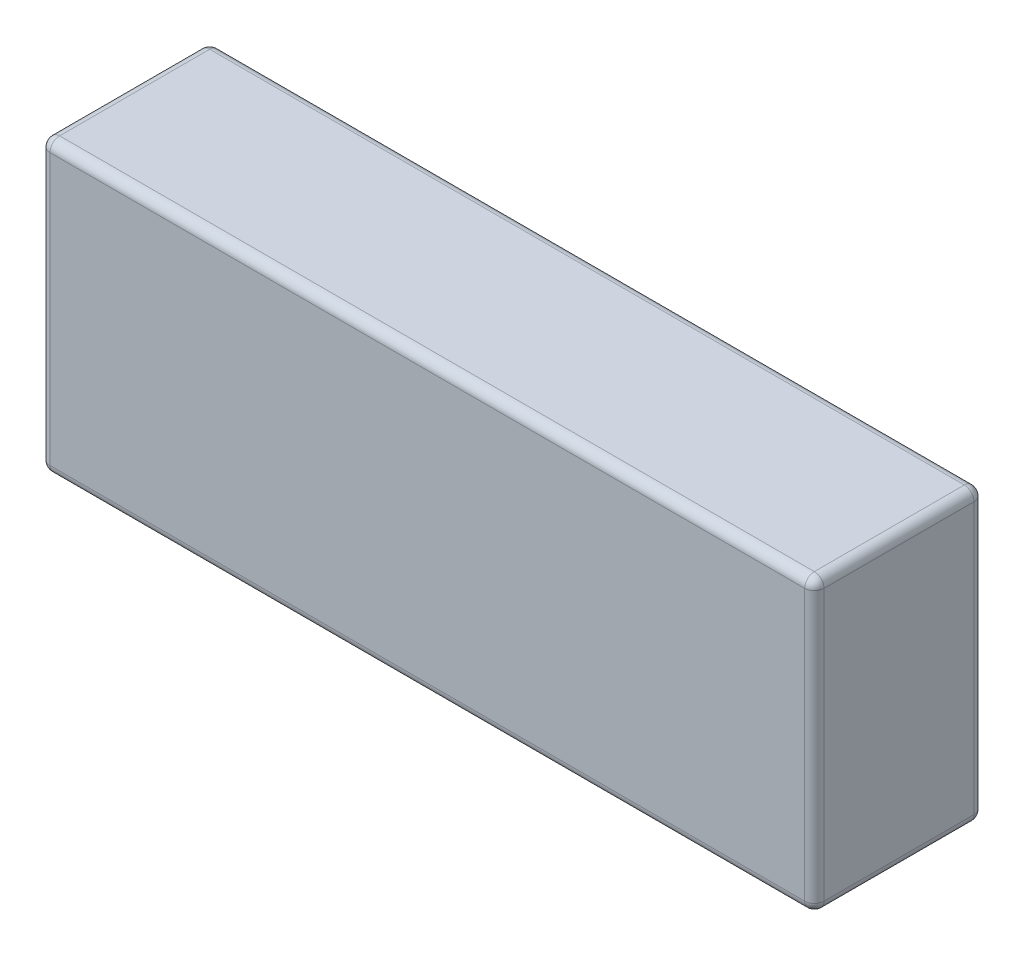
ISO-10303-21;
HEADER;
FILE_DESCRIPTION(('STEP AP214'),'2;1');
FILE_NAME('part.step','',(''),(''),'','','');
FILE_SCHEMA(('AUTOMOTIVE_DESIGN { 1 0 10303 214 1 1 1 1 }'));
ENDSEC;
DATA;
#1=APPLICATION_CONTEXT('core data for automotive mechanical design processes');
#2=APPLICATION_PROTOCOL_DEFINITION('international standard','automotive_design',2000,#1);
#3=PRODUCT_CONTEXT('',#1,'mechanical');
#4=PRODUCT('Part','Part','',(#3));
#5=PRODUCT_RELATED_PRODUCT_CATEGORY('part','',(#4));
#6=PRODUCT_DEFINITION_FORMATION('','',#4);
#7=PRODUCT_DEFINITION_CONTEXT('part definition',#1,'design');
#8=PRODUCT_DEFINITION('design','',#6,#7);
#9=PRODUCT_DEFINITION_SHAPE('','',#8);
#10=(LENGTH_UNIT() NAMED_UNIT(*) SI_UNIT(.MILLI.,.METRE.));
#11=(NAMED_UNIT(*) PLANE_ANGLE_UNIT() SI_UNIT($,.RADIAN.));
#12=(NAMED_UNIT(*) SI_UNIT($,.STERADIAN.) SOLID_ANGLE_UNIT());
#13=UNCERTAINTY_MEASURE_WITH_UNIT(LENGTH_MEASURE(1.E-05),#10,'distance_accuracy_value','');
#14=(GEOMETRIC_REPRESENTATION_CONTEXT(3) GLOBAL_UNCERTAINTY_ASSIGNED_CONTEXT((#13)) GLOBAL_UNIT_ASSIGNED_CONTEXT((#10,
#11,#12)) REPRESENTATION_CONTEXT('',''));
#15=CARTESIAN_POINT('',(0.,0.,0.));
#16=DIRECTION('',(0.,0.,1.));
#17=DIRECTION('',(1.,0.,0.));
#18=AXIS2_PLACEMENT_3D('',#15,#16,#17);
#19=CARTESIAN_POINT('',(0.,0.,35.));
#20=DIRECTION('',(1.,0.,0.));
#21=DIRECTION('',(0.,0.,-1.));
#22=AXIS2_PLACEMENT_3D('',#19,#20,#21);
#23=PLANE('',#22);
#24=DIRECTION('',(0.,-1.,0.));
#25=VECTOR('',#24,1.);
#26=CARTESIAN_POINT('',(0.,0.,2.));
#27=LINE('',#26,#25);
#28=CARTESIAN_POINT('',(0.,58.,2.));
#29=VERTEX_POINT('',#28);
#30=CARTESIAN_POINT('',(0.,2.,2.));
#31=VERTEX_POINT('',#30);
#32=EDGE_CURVE('E184',#29,#31,#27,.T.);
#33=ORIENTED_EDGE('',*,*,#32,.T.);
#34=DIRECTION('',(0.,0.,-1.));
#35=VECTOR('',#34,1.);
#36=CARTESIAN_POINT('',(0.,2.,35.));
#37=LINE('',#36,#35);
#38=CARTESIAN_POINT('',(0.,2.,33.));
#39=VERTEX_POINT('',#38);
#40=EDGE_CURVE('E187',#31,#39,#37,.F.);
#41=ORIENTED_EDGE('',*,*,#40,.T.);
#42=DIRECTION('',(0.,-1.,0.));
#43=VECTOR('',#42,1.);
#44=CARTESIAN_POINT('',(0.,0.,33.));
#45=LINE('',#44,#43);
#46=CARTESIAN_POINT('',(0.,58.,33.));
#47=VERTEX_POINT('',#46);
#48=EDGE_CURVE('E178',#39,#47,#45,.F.);
#49=ORIENTED_EDGE('',*,*,#48,.T.);
#50=DIRECTION('',(0.,0.,-1.));
#51=VECTOR('',#50,1.);
#52=CARTESIAN_POINT('',(0.,58.,35.));
#53=LINE('',#52,#51);
#54=EDGE_CURVE('E181',#47,#29,#53,.T.);
#55=ORIENTED_EDGE('',*,*,#54,.T.);
#56=EDGE_LOOP('',(#33,#41,#49,#55));
#57=FACE_BOUND('',#56,.T.);
#58=ADVANCED_FACE('F39',(#57),#23,.F.);
#59=CARTESIAN_POINT('',(0.,0.,35.));
#60=DIRECTION('',(0.,1.,0.));
#61=DIRECTION('',(0.,0.,1.));
#62=AXIS2_PLACEMENT_3D('',#59,#60,#61);
#63=PLANE('',#62);
#64=DIRECTION('',(1.,0.,0.));
#65=VECTOR('',#64,1.);
#66=CARTESIAN_POINT('',(0.,0.,33.));
#67=LINE('',#66,#65);
#68=CARTESIAN_POINT('',(158.,0.,33.));
#69=VERTEX_POINT('',#68);
#70=CARTESIAN_POINT('',(2.,0.,33.));
#71=VERTEX_POINT('',#70);
#72=EDGE_CURVE('E132',#69,#71,#67,.F.);
#73=ORIENTED_EDGE('',*,*,#72,.T.);
#74=DIRECTION('',(0.,0.,-1.));
#75=VECTOR('',#74,1.);
#76=CARTESIAN_POINT('',(2.,0.,35.));
#77=LINE('',#76,#75);
#78=CARTESIAN_POINT('',(2.,0.,2.));
#79=VERTEX_POINT('',#78);
#80=EDGE_CURVE('E175',#71,#79,#77,.T.);
#81=ORIENTED_EDGE('',*,*,#80,.T.);
#82=DIRECTION('',(1.,0.,0.));
#83=VECTOR('',#82,1.);
#84=CARTESIAN_POINT('',(160.,0.,2.));
#85=LINE('',#84,#83);
#86=CARTESIAN_POINT('',(158.,0.,2.));
#87=VERTEX_POINT('',#86);
#88=EDGE_CURVE('E135',#79,#87,#85,.T.);
#89=ORIENTED_EDGE('',*,*,#88,.T.);
#90=DIRECTION('',(0.,0.,-1.));
#91=VECTOR('',#90,1.);
#92=CARTESIAN_POINT('',(158.,0.,35.));
#93=LINE('',#92,#91);
#94=EDGE_CURVE('E127',#87,#69,#93,.F.);
#95=ORIENTED_EDGE('',*,*,#94,.T.);
#96=EDGE_LOOP('',(#73,#81,#89,#95));
#97=FACE_BOUND('',#96,.T.);
#98=ADVANCED_FACE('F129',(#97),#63,.F.);
#99=CARTESIAN_POINT('',(160.,0.,35.));
#100=DIRECTION('',(-1.,0.,0.));
#101=DIRECTION('',(0.,0.,1.));
#102=AXIS2_PLACEMENT_3D('',#99,#100,#101);
#103=PLANE('',#102);
#104=DIRECTION('',(0.,1.,0.));
#105=VECTOR('',#104,1.);
#106=CARTESIAN_POINT('',(160.,0.,33.));
#107=LINE('',#106,#105);
#108=CARTESIAN_POINT('',(160.,58.,33.));
#109=VERTEX_POINT('',#108);
#110=CARTESIAN_POINT('',(160.,2.,33.));
#111=VERTEX_POINT('',#110);
#112=EDGE_CURVE('E204',#109,#111,#107,.F.);
#113=ORIENTED_EDGE('',*,*,#112,.T.);
#114=DIRECTION('',(0.,0.,-1.));
#115=VECTOR('',#114,1.);
#116=CARTESIAN_POINT('',(160.,2.,35.));
#117=LINE('',#116,#115);
#118=CARTESIAN_POINT('',(160.,2.,2.));
#119=VERTEX_POINT('',#118);
#120=EDGE_CURVE('E147',#111,#119,#117,.T.);
#121=ORIENTED_EDGE('',*,*,#120,.T.);
#122=DIRECTION('',(0.,1.,0.));
#123=VECTOR('',#122,1.);
#124=CARTESIAN_POINT('',(160.,60.,2.));
#125=LINE('',#124,#123);
#126=CARTESIAN_POINT('',(160.,58.,2.));
#127=VERTEX_POINT('',#126);
#128=EDGE_CURVE('E210',#119,#127,#125,.T.);
#129=ORIENTED_EDGE('',*,*,#128,.T.);
#130=DIRECTION('',(0.,0.,-1.));
#131=VECTOR('',#130,1.);
#132=CARTESIAN_POINT('',(160.,58.,35.));
#133=LINE('',#132,#131);
#134=EDGE_CURVE('E207',#127,#109,#133,.F.);
#135=ORIENTED_EDGE('',*,*,#134,.T.);
#136=EDGE_LOOP('',(#113,#121,#129,#135));
#137=FACE_BOUND('',#136,.T.);
#138=ADVANCED_FACE('F378',(#137),#103,.F.);
#139=CARTESIAN_POINT('',(0.,60.,35.));
#140=DIRECTION('',(0.,-1.,0.));
#141=DIRECTION('',(0.,0.,-1.));
#142=AXIS2_PLACEMENT_3D('',#139,#140,#141);
#143=PLANE('',#142);
#144=DIRECTION('',(0.,0.,-1.));
#145=VECTOR('',#144,1.);
#146=CARTESIAN_POINT('',(158.,60.,35.));
#147=LINE('',#146,#145);
#148=CARTESIAN_POINT('',(158.,60.,33.));
#149=VERTEX_POINT('',#148);
#150=CARTESIAN_POINT('',(158.,60.,2.));
#151=VERTEX_POINT('',#150);
#152=EDGE_CURVE('E221',#149,#151,#147,.T.);
#153=ORIENTED_EDGE('',*,*,#152,.T.);
#154=DIRECTION('',(-1.,0.,0.));
#155=VECTOR('',#154,1.);
#156=CARTESIAN_POINT('',(0.,60.,2.));
#157=LINE('',#156,#155);
#158=CARTESIAN_POINT('',(2.,60.,2.));
#159=VERTEX_POINT('',#158);
#160=EDGE_CURVE('E225',#151,#159,#157,.T.);
#161=ORIENTED_EDGE('',*,*,#160,.T.);
#162=DIRECTION('',(0.,0.,-1.));
#163=VECTOR('',#162,1.);
#164=CARTESIAN_POINT('',(2.,60.,35.));
#165=LINE('',#164,#163);
#166=CARTESIAN_POINT('',(2.,60.,33.));
#167=VERTEX_POINT('',#166);
#168=EDGE_CURVE('E218',#159,#167,#165,.F.);
#169=ORIENTED_EDGE('',*,*,#168,.T.);
#170=DIRECTION('',(-1.,0.,0.));
#171=VECTOR('',#170,1.);
#172=CARTESIAN_POINT('',(0.,60.,33.));
#173=LINE('',#172,#171);
#174=EDGE_CURVE('E215',#167,#149,#173,.F.);
#175=ORIENTED_EDGE('',*,*,#174,.T.);
#176=EDGE_LOOP('',(#153,#161,#169,#175));
#177=FACE_BOUND('',#176,.T.);
#178=ADVANCED_FACE('F327',(#177),#143,.F.);
#179=CARTESIAN_POINT('',(0.,0.,35.));
#180=DIRECTION('',(0.,0.,-1.));
#181=DIRECTION('',(-1.,0.,0.));
#182=AXIS2_PLACEMENT_3D('',#179,#180,#181);
#183=PLANE('',#182);
#184=DIRECTION('',(0.,1.,0.));
#185=VECTOR('',#184,1.);
#186=CARTESIAN_POINT('',(158.,0.,35.));
#187=LINE('',#186,#185);
#188=CARTESIAN_POINT('',(158.,2.,35.));
#189=VERTEX_POINT('',#188);
#190=CARTESIAN_POINT('',(158.,58.,35.));
#191=VERTEX_POINT('',#190);
#192=EDGE_CURVE('E49',#189,#191,#187,.T.);
#193=ORIENTED_EDGE('',*,*,#192,.T.);
#194=DIRECTION('',(-1.,0.,0.));
#195=VECTOR('',#194,1.);
#196=CARTESIAN_POINT('',(0.,58.,35.));
#197=LINE('',#196,#195);
#198=CARTESIAN_POINT('',(2.,58.,35.));
#199=VERTEX_POINT('',#198);
#200=EDGE_CURVE('E11',#191,#199,#197,.T.);
#201=ORIENTED_EDGE('',*,*,#200,.T.);
#202=DIRECTION('',(0.,-1.,0.));
#203=VECTOR('',#202,1.);
#204=CARTESIAN_POINT('',(2.,0.,35.));
#205=LINE('',#204,#203);
#206=CARTESIAN_POINT('',(2.,2.,35.));
#207=VERTEX_POINT('',#206);
#208=EDGE_CURVE('E228',#199,#207,#205,.T.);
#209=ORIENTED_EDGE('',*,*,#208,.T.);
#210=DIRECTION('',(1.,0.,0.));
#211=VECTOR('',#210,1.);
#212=CARTESIAN_POINT('',(0.,2.,35.));
#213=LINE('',#212,#211);
#214=EDGE_CURVE('E60',#207,#189,#213,.T.);
#215=ORIENTED_EDGE('',*,*,#214,.T.);
#216=EDGE_LOOP('',(#193,#201,#209,#215));
#217=FACE_BOUND('',#216,.T.);
#218=ADVANCED_FACE('F342',(#217),#183,.F.);
#219=CARTESIAN_POINT('',(0.,0.,0.));
#220=DIRECTION('',(0.,0.,-1.));
#221=DIRECTION('',(-1.,0.,0.));
#222=AXIS2_PLACEMENT_3D('',#219,#220,#221);
#223=PLANE('',#222);
#224=DIRECTION('',(0.,1.,0.));
#225=VECTOR('',#224,1.);
#226=CARTESIAN_POINT('',(158.,0.,0.));
#227=LINE('',#226,#225);
#228=CARTESIAN_POINT('',(158.,58.,0.));
#229=VERTEX_POINT('',#228);
#230=CARTESIAN_POINT('',(158.,2.,0.));
#231=VERTEX_POINT('',#230);
#232=EDGE_CURVE('E194',#229,#231,#227,.F.);
#233=ORIENTED_EDGE('',*,*,#232,.T.);
#234=DIRECTION('',(1.,0.,0.));
#235=VECTOR('',#234,1.);
#236=CARTESIAN_POINT('',(0.,2.,0.));
#237=LINE('',#236,#235);
#238=CARTESIAN_POINT('',(2.,2.,0.));
#239=VERTEX_POINT('',#238);
#240=EDGE_CURVE('E200',#231,#239,#237,.F.);
#241=ORIENTED_EDGE('',*,*,#240,.T.);
#242=DIRECTION('',(0.,-1.,0.));
#243=VECTOR('',#242,1.);
#244=CARTESIAN_POINT('',(2.,60.,0.));
#245=LINE('',#244,#243);
#246=CARTESIAN_POINT('',(2.,58.,0.));
#247=VERTEX_POINT('',#246);
#248=EDGE_CURVE('E197',#239,#247,#245,.F.);
#249=ORIENTED_EDGE('',*,*,#248,.T.);
#250=DIRECTION('',(-1.,0.,0.));
#251=VECTOR('',#250,1.);
#252=CARTESIAN_POINT('',(160.,58.,0.));
#253=LINE('',#252,#251);
#254=EDGE_CURVE('E191',#247,#229,#253,.F.);
#255=ORIENTED_EDGE('',*,*,#254,.T.);
#256=EDGE_LOOP('',(#233,#241,#249,#255));
#257=FACE_BOUND('',#256,.T.);
#258=ADVANCED_FACE('F318',(#257),#223,.T.);
#259=CARTESIAN_POINT('',(158.,58.,35.));
#260=DIRECTION('',(0.,0.,-1.));
#261=DIRECTION('',(-1.,0.,0.));
#262=AXIS2_PLACEMENT_3D('',#259,#260,#261);
#263=CYLINDRICAL_SURFACE('',#262,2.);
#264=CARTESIAN_POINT('',(158.,58.,33.));
#265=DIRECTION('',(0.,0.,1.));
#266=DIRECTION('',(1.,0.,0.));
#267=AXIS2_PLACEMENT_3D('',#264,#265,#266);
#268=CIRCLE('',#267,2.);
#269=EDGE_CURVE('E43',#109,#149,#268,.T.);
#270=ORIENTED_EDGE('',*,*,#269,.F.);
#271=ORIENTED_EDGE('',*,*,#134,.F.);
#272=CARTESIAN_POINT('',(158.,58.,2.));
#273=DIRECTION('',(0.,0.,-1.));
#274=DIRECTION('',(-1.,0.,0.));
#275=AXIS2_PLACEMENT_3D('',#272,#273,#274);
#276=CIRCLE('',#275,2.);
#277=EDGE_CURVE('E171',#151,#127,#276,.T.);
#278=ORIENTED_EDGE('',*,*,#277,.F.);
#279=ORIENTED_EDGE('',*,*,#152,.F.);
#280=EDGE_LOOP('',(#270,#271,#278,#279));
#281=FACE_BOUND('',#280,.T.);
#282=ADVANCED_FACE('F41',(#281),#263,.T.);
#283=CARTESIAN_POINT('',(158.,58.,33.));
#284=DIRECTION('',(0.,0.,1.));
#285=DIRECTION('',(1.,0.,0.));
#286=AXIS2_PLACEMENT_3D('',#283,#284,#285);
#287=SPHERICAL_SURFACE('',#286,2.);
#288=CARTESIAN_POINT('',(158.,58.,33.));
#289=DIRECTION('',(0.,1.,0.));
#290=DIRECTION('',(0.,0.,1.));
#291=AXIS2_PLACEMENT_3D('',#288,#289,#290);
#292=CIRCLE('',#291,2.);
#293=EDGE_CURVE('E295',#109,#191,#292,.F.);
#294=ORIENTED_EDGE('',*,*,#293,.F.);
#295=ORIENTED_EDGE('',*,*,#269,.T.);
#296=CARTESIAN_POINT('',(158.,58.,33.));
#297=DIRECTION('',(1.,0.,0.));
#298=DIRECTION('',(0.,0.,-1.));
#299=AXIS2_PLACEMENT_3D('',#296,#297,#298);
#300=CIRCLE('',#299,2.);
#301=EDGE_CURVE('E298',#191,#149,#300,.F.);
#302=ORIENTED_EDGE('',*,*,#301,.F.);
#303=EDGE_LOOP('',(#294,#295,#302));
#304=FACE_BOUND('',#303,.T.);
#305=ADVANCED_FACE('F511',(#304),#287,.T.);
#306=CARTESIAN_POINT('',(158.,58.,2.));
#307=DIRECTION('',(0.,0.,1.));
#308=DIRECTION('',(1.,0.,0.));
#309=AXIS2_PLACEMENT_3D('',#306,#307,#308);
#310=SPHERICAL_SURFACE('',#309,2.);
#311=CARTESIAN_POINT('',(158.,58.,2.));
#312=DIRECTION('',(1.,0.,0.));
#313=DIRECTION('',(0.,0.,-1.));
#314=AXIS2_PLACEMENT_3D('',#311,#312,#313);
#315=CIRCLE('',#314,2.);
#316=EDGE_CURVE('E287',#151,#229,#315,.F.);
#317=ORIENTED_EDGE('',*,*,#316,.F.);
#318=ORIENTED_EDGE('',*,*,#277,.T.);
#319=CARTESIAN_POINT('',(158.,58.,2.));
#320=DIRECTION('',(0.,1.,0.));
#321=DIRECTION('',(0.,0.,1.));
#322=AXIS2_PLACEMENT_3D('',#319,#320,#321);
#323=CIRCLE('',#322,2.);
#324=EDGE_CURVE('E291',#229,#127,#323,.F.);
#325=ORIENTED_EDGE('',*,*,#324,.F.);
#326=EDGE_LOOP('',(#317,#318,#325));
#327=FACE_BOUND('',#326,.T.);
#328=ADVANCED_FACE('F307',(#327),#310,.T.);
#329=CARTESIAN_POINT('',(0.,58.,33.));
#330=DIRECTION('',(-1.,0.,0.));
#331=DIRECTION('',(0.,0.,1.));
#332=AXIS2_PLACEMENT_3D('',#329,#330,#331);
#333=CYLINDRICAL_SURFACE('',#332,2.);
#334=ORIENTED_EDGE('',*,*,#301,.T.);
#335=ORIENTED_EDGE('',*,*,#174,.F.);
#336=CARTESIAN_POINT('',(2.,58.,33.));
#337=DIRECTION('',(-1.,0.,0.));
#338=DIRECTION('',(0.,0.,1.));
#339=AXIS2_PLACEMENT_3D('',#336,#337,#338);
#340=CIRCLE('',#339,2.);
#341=EDGE_CURVE('E279',#199,#167,#340,.T.);
#342=ORIENTED_EDGE('',*,*,#341,.F.);
#343=ORIENTED_EDGE('',*,*,#200,.F.);
#344=EDGE_LOOP('',(#334,#335,#342,#343));
#345=FACE_BOUND('',#344,.T.);
#346=ADVANCED_FACE('F341',(#345),#333,.T.);
#347=CARTESIAN_POINT('',(158.,0.,33.));
#348=DIRECTION('',(0.,1.,0.));
#349=DIRECTION('',(0.,0.,1.));
#350=AXIS2_PLACEMENT_3D('',#347,#348,#349);
#351=CYLINDRICAL_SURFACE('',#350,2.);
#352=ORIENTED_EDGE('',*,*,#293,.T.);
#353=ORIENTED_EDGE('',*,*,#192,.F.);
#354=CARTESIAN_POINT('',(158.,2.,33.));
#355=DIRECTION('',(0.,-1.,0.));
#356=DIRECTION('',(0.,0.,-1.));
#357=AXIS2_PLACEMENT_3D('',#354,#355,#356);
#358=CIRCLE('',#357,2.);
#359=EDGE_CURVE('E152',#111,#189,#358,.T.);
#360=ORIENTED_EDGE('',*,*,#359,.F.);
#361=ORIENTED_EDGE('',*,*,#112,.F.);
#362=EDGE_LOOP('',(#352,#353,#360,#361));
#363=FACE_BOUND('',#362,.T.);
#364=ADVANCED_FACE('F488',(#363),#351,.T.);
#365=CARTESIAN_POINT('',(158.,2.,35.));
#366=DIRECTION('',(0.,0.,-1.));
#367=DIRECTION('',(-1.,0.,0.));
#368=AXIS2_PLACEMENT_3D('',#365,#366,#367);
#369=CYLINDRICAL_SURFACE('',#368,2.);
#370=CARTESIAN_POINT('',(158.,2.,2.));
#371=DIRECTION('',(0.,0.,-1.));
#372=DIRECTION('',(-1.,0.,0.));
#373=AXIS2_PLACEMENT_3D('',#370,#371,#372);
#374=CIRCLE('',#373,2.);
#375=EDGE_CURVE('E153',#119,#87,#374,.T.);
#376=ORIENTED_EDGE('',*,*,#375,.F.);
#377=ORIENTED_EDGE('',*,*,#120,.F.);
#378=CARTESIAN_POINT('',(158.,2.,33.));
#379=DIRECTION('',(0.,0.,1.));
#380=DIRECTION('',(1.,0.,0.));
#381=AXIS2_PLACEMENT_3D('',#378,#379,#380);
#382=CIRCLE('',#381,2.);
#383=EDGE_CURVE('E143',#69,#111,#382,.T.);
#384=ORIENTED_EDGE('',*,*,#383,.F.);
#385=ORIENTED_EDGE('',*,*,#94,.F.);
#386=EDGE_LOOP('',(#376,#377,#384,#385));
#387=FACE_BOUND('',#386,.T.);
#388=ADVANCED_FACE('F145',(#387),#369,.T.);
#389=CARTESIAN_POINT('',(158.,0.,2.));
#390=DIRECTION('',(0.,-1.,0.));
#391=DIRECTION('',(0.,0.,-1.));
#392=AXIS2_PLACEMENT_3D('',#389,#390,#391);
#393=CYLINDRICAL_SURFACE('',#392,2.);
#394=ORIENTED_EDGE('',*,*,#324,.T.);
#395=ORIENTED_EDGE('',*,*,#128,.F.);
#396=CARTESIAN_POINT('',(158.,2.,2.));
#397=DIRECTION('',(0.,-1.,0.));
#398=DIRECTION('',(0.,0.,-1.));
#399=AXIS2_PLACEMENT_3D('',#396,#397,#398);
#400=CIRCLE('',#399,2.);
#401=EDGE_CURVE('E272',#231,#119,#400,.T.);
#402=ORIENTED_EDGE('',*,*,#401,.F.);
#403=ORIENTED_EDGE('',*,*,#232,.F.);
#404=EDGE_LOOP('',(#394,#395,#402,#403));
#405=FACE_BOUND('',#404,.T.);
#406=ADVANCED_FACE('F314',(#405),#393,.T.);
#407=CARTESIAN_POINT('',(0.,58.,2.));
#408=DIRECTION('',(1.,0.,0.));
#409=DIRECTION('',(0.,0.,-1.));
#410=AXIS2_PLACEMENT_3D('',#407,#408,#409);
#411=CYLINDRICAL_SURFACE('',#410,2.);
#412=ORIENTED_EDGE('',*,*,#316,.T.);
#413=ORIENTED_EDGE('',*,*,#254,.F.);
#414=CARTESIAN_POINT('',(2.,58.,2.));
#415=DIRECTION('',(-1.,0.,0.));
#416=DIRECTION('',(0.,0.,1.));
#417=AXIS2_PLACEMENT_3D('',#414,#415,#416);
#418=CIRCLE('',#417,2.);
#419=EDGE_CURVE('E268',#159,#247,#418,.T.);
#420=ORIENTED_EDGE('',*,*,#419,.F.);
#421=ORIENTED_EDGE('',*,*,#160,.F.);
#422=EDGE_LOOP('',(#412,#413,#420,#421));
#423=FACE_BOUND('',#422,.T.);
#424=ADVANCED_FACE('F324',(#423),#411,.T.);
#425=CARTESIAN_POINT('',(2.,58.,35.));
#426=DIRECTION('',(0.,0.,-1.));
#427=DIRECTION('',(-1.,0.,0.));
#428=AXIS2_PLACEMENT_3D('',#425,#426,#427);
#429=CYLINDRICAL_SURFACE('',#428,2.);
#430=CARTESIAN_POINT('',(2.,58.,33.));
#431=DIRECTION('',(0.,0.,1.));
#432=DIRECTION('',(1.,0.,0.));
#433=AXIS2_PLACEMENT_3D('',#430,#431,#432);
#434=CIRCLE('',#433,2.);
#435=EDGE_CURVE('E283',#167,#47,#434,.T.);
#436=ORIENTED_EDGE('',*,*,#435,.F.);
#437=ORIENTED_EDGE('',*,*,#168,.F.);
#438=CARTESIAN_POINT('',(2.,58.,2.));
#439=DIRECTION('',(0.,0.,-1.));
#440=DIRECTION('',(-1.,0.,0.));
#441=AXIS2_PLACEMENT_3D('',#438,#439,#440);
#442=CIRCLE('',#441,2.);
#443=EDGE_CURVE('E264',#29,#159,#442,.T.);
#444=ORIENTED_EDGE('',*,*,#443,.F.);
#445=ORIENTED_EDGE('',*,*,#54,.F.);
#446=EDGE_LOOP('',(#436,#437,#444,#445));
#447=FACE_BOUND('',#446,.T.);
#448=ADVANCED_FACE('F332',(#447),#429,.T.);
#449=CARTESIAN_POINT('',(2.,58.,33.));
#450=DIRECTION('',(0.,0.,1.));
#451=DIRECTION('',(1.,0.,0.));
#452=AXIS2_PLACEMENT_3D('',#449,#450,#451);
#453=SPHERICAL_SURFACE('',#452,2.);
#454=ORIENTED_EDGE('',*,*,#341,.T.);
#455=ORIENTED_EDGE('',*,*,#435,.T.);
#456=CARTESIAN_POINT('',(2.,58.,33.));
#457=DIRECTION('',(0.,1.,0.));
#458=DIRECTION('',(0.,0.,1.));
#459=AXIS2_PLACEMENT_3D('',#456,#457,#458);
#460=CIRCLE('',#459,2.);
#461=EDGE_CURVE('E160',#199,#47,#460,.F.);
#462=ORIENTED_EDGE('',*,*,#461,.F.);
#463=EDGE_LOOP('',(#454,#455,#462));
#464=FACE_BOUND('',#463,.T.);
#465=ADVANCED_FACE('F338',(#464),#453,.T.);
#466=CARTESIAN_POINT('',(158.,2.,33.));
#467=DIRECTION('',(0.,0.,1.));
#468=DIRECTION('',(1.,0.,0.));
#469=AXIS2_PLACEMENT_3D('',#466,#467,#468);
#470=SPHERICAL_SURFACE('',#469,2.);
#471=ORIENTED_EDGE('',*,*,#383,.T.);
#472=ORIENTED_EDGE('',*,*,#359,.T.);
#473=CARTESIAN_POINT('',(158.,2.,33.));
#474=DIRECTION('',(1.,0.,0.));
#475=DIRECTION('',(0.,0.,-1.));
#476=AXIS2_PLACEMENT_3D('',#473,#474,#475);
#477=CIRCLE('',#476,2.);
#478=EDGE_CURVE('E156',#69,#189,#477,.F.);
#479=ORIENTED_EDGE('',*,*,#478,.F.);
#480=EDGE_LOOP('',(#471,#472,#479));
#481=FACE_BOUND('',#480,.T.);
#482=ADVANCED_FACE('F157',(#481),#470,.T.);
#483=CARTESIAN_POINT('',(158.,2.,2.));
#484=DIRECTION('',(0.,0.,1.));
#485=DIRECTION('',(1.,0.,0.));
#486=AXIS2_PLACEMENT_3D('',#483,#484,#485);
#487=SPHERICAL_SURFACE('',#486,2.);
#488=ORIENTED_EDGE('',*,*,#401,.T.);
#489=ORIENTED_EDGE('',*,*,#375,.T.);
#490=CARTESIAN_POINT('',(158.,2.,2.));
#491=DIRECTION('',(1.,0.,0.));
#492=DIRECTION('',(0.,0.,-1.));
#493=AXIS2_PLACEMENT_3D('',#490,#491,#492);
#494=CIRCLE('',#493,2.);
#495=EDGE_CURVE('E161',#231,#87,#494,.F.);
#496=ORIENTED_EDGE('',*,*,#495,.F.);
#497=EDGE_LOOP('',(#488,#489,#496));
#498=FACE_BOUND('',#497,.T.);
#499=ADVANCED_FACE('F361',(#498),#487,.T.);
#500=CARTESIAN_POINT('',(2.,58.,2.));
#501=DIRECTION('',(0.,0.,1.));
#502=DIRECTION('',(1.,0.,0.));
#503=AXIS2_PLACEMENT_3D('',#500,#501,#502);
#504=SPHERICAL_SURFACE('',#503,2.);
#505=ORIENTED_EDGE('',*,*,#443,.T.);
#506=ORIENTED_EDGE('',*,*,#419,.T.);
#507=CARTESIAN_POINT('',(2.,58.,2.));
#508=DIRECTION('',(0.,1.,0.));
#509=DIRECTION('',(0.,0.,1.));
#510=AXIS2_PLACEMENT_3D('',#507,#508,#509);
#511=CIRCLE('',#510,2.);
#512=EDGE_CURVE('E254',#29,#247,#511,.F.);
#513=ORIENTED_EDGE('',*,*,#512,.F.);
#514=EDGE_LOOP('',(#505,#506,#513));
#515=FACE_BOUND('',#514,.T.);
#516=ADVANCED_FACE('F363',(#515),#504,.T.);
#517=CARTESIAN_POINT('',(2.,0.,33.));
#518=DIRECTION('',(0.,-1.,0.));
#519=DIRECTION('',(0.,0.,-1.));
#520=AXIS2_PLACEMENT_3D('',#517,#518,#519);
#521=CYLINDRICAL_SURFACE('',#520,2.);
#522=ORIENTED_EDGE('',*,*,#461,.T.);
#523=ORIENTED_EDGE('',*,*,#48,.F.);
#524=CARTESIAN_POINT('',(2.,2.,33.));
#525=DIRECTION('',(0.,-1.,0.));
#526=DIRECTION('',(0.,0.,-1.));
#527=AXIS2_PLACEMENT_3D('',#524,#525,#526);
#528=CIRCLE('',#527,2.);
#529=EDGE_CURVE('E250',#207,#39,#528,.T.);
#530=ORIENTED_EDGE('',*,*,#529,.F.);
#531=ORIENTED_EDGE('',*,*,#208,.F.);
#532=EDGE_LOOP('',(#522,#523,#530,#531));
#533=FACE_BOUND('',#532,.T.);
#534=ADVANCED_FACE('F346',(#533),#521,.T.);
#535=CARTESIAN_POINT('',(0.,2.,33.));
#536=DIRECTION('',(1.,0.,0.));
#537=DIRECTION('',(0.,0.,-1.));
#538=AXIS2_PLACEMENT_3D('',#535,#536,#537);
#539=CYLINDRICAL_SURFACE('',#538,2.);
#540=ORIENTED_EDGE('',*,*,#478,.T.);
#541=ORIENTED_EDGE('',*,*,#214,.F.);
#542=CARTESIAN_POINT('',(2.,2.,33.));
#543=DIRECTION('',(-1.,0.,0.));
#544=DIRECTION('',(0.,0.,1.));
#545=AXIS2_PLACEMENT_3D('',#542,#543,#544);
#546=CIRCLE('',#545,2.);
#547=EDGE_CURVE('E165',#71,#207,#546,.T.);
#548=ORIENTED_EDGE('',*,*,#547,.F.);
#549=ORIENTED_EDGE('',*,*,#72,.F.);
#550=EDGE_LOOP('',(#540,#541,#548,#549));
#551=FACE_BOUND('',#550,.T.);
#552=ADVANCED_FACE('F163',(#551),#539,.T.);
#553=CARTESIAN_POINT('',(0.,2.,2.));
#554=DIRECTION('',(-1.,0.,0.));
#555=DIRECTION('',(0.,0.,1.));
#556=AXIS2_PLACEMENT_3D('',#553,#554,#555);
#557=CYLINDRICAL_SURFACE('',#556,2.);
#558=ORIENTED_EDGE('',*,*,#495,.T.);
#559=ORIENTED_EDGE('',*,*,#88,.F.);
#560=CARTESIAN_POINT('',(2.,2.,2.));
#561=DIRECTION('',(-1.,0.,0.));
#562=DIRECTION('',(0.,0.,1.));
#563=AXIS2_PLACEMENT_3D('',#560,#561,#562);
#564=CIRCLE('',#563,2.);
#565=EDGE_CURVE('E244',#239,#79,#564,.T.);
#566=ORIENTED_EDGE('',*,*,#565,.F.);
#567=ORIENTED_EDGE('',*,*,#240,.F.);
#568=EDGE_LOOP('',(#558,#559,#566,#567));
#569=FACE_BOUND('',#568,.T.);
#570=ADVANCED_FACE('F359',(#569),#557,.T.);
#571=CARTESIAN_POINT('',(2.,0.,2.));
#572=DIRECTION('',(0.,1.,0.));
#573=DIRECTION('',(0.,0.,1.));
#574=AXIS2_PLACEMENT_3D('',#571,#572,#573);
#575=CYLINDRICAL_SURFACE('',#574,2.);
#576=ORIENTED_EDGE('',*,*,#512,.T.);
#577=ORIENTED_EDGE('',*,*,#248,.F.);
#578=CARTESIAN_POINT('',(2.,2.,2.));
#579=DIRECTION('',(0.,-1.,0.));
#580=DIRECTION('',(0.,0.,-1.));
#581=AXIS2_PLACEMENT_3D('',#578,#579,#580);
#582=CIRCLE('',#581,2.);
#583=EDGE_CURVE('E241',#31,#239,#582,.T.);
#584=ORIENTED_EDGE('',*,*,#583,.F.);
#585=ORIENTED_EDGE('',*,*,#32,.F.);
#586=EDGE_LOOP('',(#576,#577,#584,#585));
#587=FACE_BOUND('',#586,.T.);
#588=ADVANCED_FACE('F388',(#587),#575,.T.);
#589=CARTESIAN_POINT('',(2.,2.,33.));
#590=DIRECTION('',(0.,0.,1.));
#591=DIRECTION('',(1.,0.,0.));
#592=AXIS2_PLACEMENT_3D('',#589,#590,#591);
#593=SPHERICAL_SURFACE('',#592,2.);
#594=ORIENTED_EDGE('',*,*,#547,.T.);
#595=ORIENTED_EDGE('',*,*,#529,.T.);
#596=CARTESIAN_POINT('',(2.,2.,33.));
#597=DIRECTION('',(0.,0.,1.));
#598=DIRECTION('',(1.,0.,0.));
#599=AXIS2_PLACEMENT_3D('',#596,#597,#598);
#600=CIRCLE('',#599,2.);
#601=EDGE_CURVE('E238',#71,#39,#600,.F.);
#602=ORIENTED_EDGE('',*,*,#601,.F.);
#603=EDGE_LOOP('',(#594,#595,#602));
#604=FACE_BOUND('',#603,.T.);
#605=ADVANCED_FACE('F348',(#604),#593,.T.);
#606=CARTESIAN_POINT('',(2.,2.,2.));
#607=DIRECTION('',(0.,0.,1.));
#608=DIRECTION('',(1.,0.,0.));
#609=AXIS2_PLACEMENT_3D('',#606,#607,#608);
#610=SPHERICAL_SURFACE('',#609,2.);
#611=ORIENTED_EDGE('',*,*,#583,.T.);
#612=ORIENTED_EDGE('',*,*,#565,.T.);
#613=CARTESIAN_POINT('',(2.,2.,2.));
#614=DIRECTION('',(0.,0.,-1.));
#615=DIRECTION('',(-1.,0.,0.));
#616=AXIS2_PLACEMENT_3D('',#613,#614,#615);
#617=CIRCLE('',#616,2.);
#618=EDGE_CURVE('E235',#31,#79,#617,.F.);
#619=ORIENTED_EDGE('',*,*,#618,.F.);
#620=EDGE_LOOP('',(#611,#612,#619));
#621=FACE_BOUND('',#620,.T.);
#622=ADVANCED_FACE('F356',(#621),#610,.T.);
#623=CARTESIAN_POINT('',(2.,2.,35.));
#624=DIRECTION('',(0.,0.,-1.));
#625=DIRECTION('',(-1.,0.,0.));
#626=AXIS2_PLACEMENT_3D('',#623,#624,#625);
#627=CYLINDRICAL_SURFACE('',#626,2.);
#628=ORIENTED_EDGE('',*,*,#601,.T.);
#629=ORIENTED_EDGE('',*,*,#40,.F.);
#630=ORIENTED_EDGE('',*,*,#618,.T.);
#631=ORIENTED_EDGE('',*,*,#80,.F.);
#632=EDGE_LOOP('',(#628,#629,#630,#631));
#633=FACE_BOUND('',#632,.T.);
#634=ADVANCED_FACE('F352',(#633),#627,.T.);
#635=CLOSED_SHELL('',(#58,#98,#138,#178,#218,#258,#282,#305,#328,#346,#364,#388,#406,#424,#448,
#465,#482,#499,#516,#534,#552,#570,#588,#605,#622,#634));
#636=MANIFOLD_SOLID_BREP('B2',#635);
#637=ADVANCED_BREP_SHAPE_REPRESENTATION('',(#18,#636),#14);
#638=SHAPE_DEFINITION_REPRESENTATION(#9,#637);
ENDSEC;
END-ISO-10303-21;
